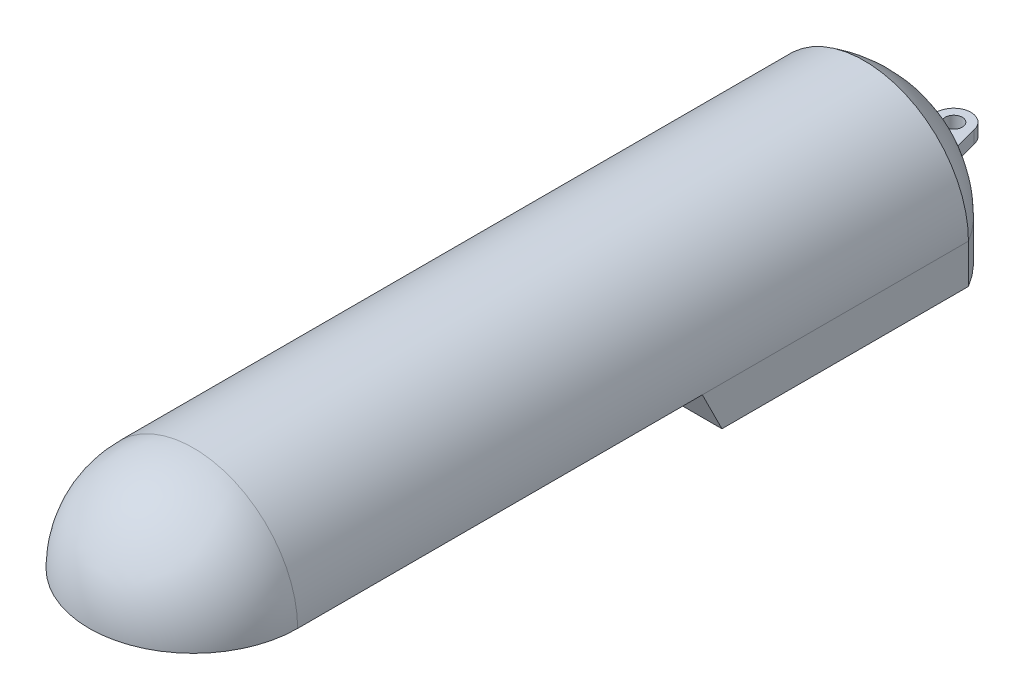
ISO-10303-21;
HEADER;
FILE_DESCRIPTION(('STEP AP214'),'2;1');
FILE_NAME('part.step','',(''),(''),'','','');
FILE_SCHEMA(('AUTOMOTIVE_DESIGN { 1 0 10303 214 1 1 1 1 }'));
ENDSEC;
DATA;
#1=APPLICATION_CONTEXT('core data for automotive mechanical design processes');
#2=APPLICATION_PROTOCOL_DEFINITION('international standard','automotive_design',2000,#1);
#3=PRODUCT_CONTEXT('',#1,'mechanical');
#4=PRODUCT('Part','Part','',(#3));
#5=PRODUCT_RELATED_PRODUCT_CATEGORY('part','',(#4));
#6=PRODUCT_DEFINITION_FORMATION('','',#4);
#7=PRODUCT_DEFINITION_CONTEXT('part definition',#1,'design');
#8=PRODUCT_DEFINITION('design','',#6,#7);
#9=PRODUCT_DEFINITION_SHAPE('','',#8);
#10=(LENGTH_UNIT() NAMED_UNIT(*) SI_UNIT(.MILLI.,.METRE.));
#11=(NAMED_UNIT(*) PLANE_ANGLE_UNIT() SI_UNIT($,.RADIAN.));
#12=(NAMED_UNIT(*) SI_UNIT($,.STERADIAN.) SOLID_ANGLE_UNIT());
#13=UNCERTAINTY_MEASURE_WITH_UNIT(LENGTH_MEASURE(1.E-05),#10,'distance_accuracy_value','');
#14=(GEOMETRIC_REPRESENTATION_CONTEXT(3) GLOBAL_UNCERTAINTY_ASSIGNED_CONTEXT((#13)) GLOBAL_UNIT_ASSIGNED_CONTEXT((#10,
#11,#12)) REPRESENTATION_CONTEXT('',''));
#15=CARTESIAN_POINT('',(0.,0.,0.));
#16=DIRECTION('',(0.,0.,1.));
#17=DIRECTION('',(1.,0.,0.));
#18=AXIS2_PLACEMENT_3D('',#15,#16,#17);
#19=CARTESIAN_POINT('',(0.,-2.49999999999999,-82.8697916666667));
#20=DIRECTION('',(0.,1.,0.));
#21=DIRECTION('',(-1.,0.,0.));
#22=AXIS2_PLACEMENT_3D('',#19,#20,#21);
#23=PLANE('',#22);
#24=CARTESIAN_POINT('',(0.,-2.49999999999999,-145.));
#25=DIRECTION('',(0.,1.,0.));
#26=DIRECTION('',(-1.,0.,0.));
#27=AXIS2_PLACEMENT_3D('',#24,#25,#26);
#28=CIRCLE('',#27,3.49999999999999);
#29=CARTESIAN_POINT('',(-3.49999999999999,-2.49999999999999,-145.));
#30=VERTEX_POINT('',#29);
#31=EDGE_CURVE('E350',#30,#30,#28,.T.);
#32=ORIENTED_EDGE('',*,*,#31,.T.);
#33=EDGE_LOOP('',(#32));
#34=FACE_BOUND('',#33,.T.);
#35=CARTESIAN_POINT('',(0.,-2.49999999999999,-82.8697916666667));
#36=DIRECTION('',(0.,-1.,0.));
#37=DIRECTION('',(-1.,0.,0.));
#38=AXIS2_PLACEMENT_3D('',#35,#36,#37);
#39=CIRCLE('',#38,49.6302083333333);
#40=CARTESIAN_POINT('',(-10.9239933505044,-2.49999999999999,-131.282847224937));
#41=VERTEX_POINT('',#40);
#42=CARTESIAN_POINT('',(10.9239933505044,-2.49999999999998,-131.282847224937));
#43=VERTEX_POINT('',#42);
#44=EDGE_CURVE('E12',#41,#43,#39,.T.);
#45=ORIENTED_EDGE('',*,*,#44,.F.);
#46=DIRECTION('',(0.259513331356115,0.,-0.965739525363051));
#47=VECTOR('',#46,1.);
#48=CARTESIAN_POINT('',(-6.8477866983021,-2.49999999999999,-146.451832405809));
#49=LINE('',#48,#47);
#50=CARTESIAN_POINT('',(-6.8477866983021,-2.49999999999999,-146.451832405809));
#51=VERTEX_POINT('',#50);
#52=EDGE_CURVE('E326',#41,#51,#49,.T.);
#53=ORIENTED_EDGE('',*,*,#52,.T.);
#54=CARTESIAN_POINT('',(0.,-2.49999999999999,-145.));
#55=DIRECTION('',(0.,-1.,0.));
#56=DIRECTION('',(-1.,0.,0.));
#57=AXIS2_PLACEMENT_3D('',#54,#55,#56);
#58=CIRCLE('',#57,7.00000000000002);
#59=CARTESIAN_POINT('',(6.84778669830212,-2.49999999999998,-146.451832405809));
#60=VERTEX_POINT('',#59);
#61=EDGE_CURVE('E329',#51,#60,#58,.T.);
#62=ORIENTED_EDGE('',*,*,#61,.T.);
#63=DIRECTION('',(0.259513331356117,0.,0.965739525363051));
#64=VECTOR('',#63,1.);
#65=CARTESIAN_POINT('',(10.9239933505044,-2.49999999999998,-131.282847224937));
#66=LINE('',#65,#64);
#67=EDGE_CURVE('E324',#60,#43,#66,.T.);
#68=ORIENTED_EDGE('',*,*,#67,.T.);
#69=EDGE_LOOP('',(#45,#53,#62,#68));
#70=FACE_BOUND('',#69,.T.);
#71=ADVANCED_FACE('F52',(#34,#70),#23,.F.);
#72=CARTESIAN_POINT('',(13.25,0.,37.5));
#73=DIRECTION('',(0.,-1.,0.));
#74=DIRECTION('',(0.,0.,-1.));
#75=AXIS2_PLACEMENT_3D('',#72,#73,#74);
#76=PLANE('',#75);
#77=DIRECTION('',(0.,0.,-1.));
#78=VECTOR('',#77,1.);
#79=CARTESIAN_POINT('',(-40.5,0.,165.));
#80=LINE('',#79,#78);
#81=CARTESIAN_POINT('',(-40.5,0.,165.));
#82=VERTEX_POINT('',#81);
#83=CARTESIAN_POINT('',(-40.5,0.,0.));
#84=VERTEX_POINT('',#83);
#85=EDGE_CURVE('E341',#82,#84,#80,.T.);
#86=ORIENTED_EDGE('',*,*,#85,.F.);
#87=CARTESIAN_POINT('',(0.,0.,165.));
#88=DIRECTION('',(0.,-1.,0.));
#89=DIRECTION('',(-1.,0.,0.));
#90=AXIS2_PLACEMENT_3D('',#87,#88,#89);
#91=CIRCLE('',#90,40.5);
#92=CARTESIAN_POINT('',(40.5,0.,165.));
#93=VERTEX_POINT('',#92);
#94=EDGE_CURVE('E159',#93,#82,#91,.T.);
#95=ORIENTED_EDGE('',*,*,#94,.F.);
#96=DIRECTION('',(0.,0.,-1.));
#97=VECTOR('',#96,1.);
#98=CARTESIAN_POINT('',(40.5,0.,165.));
#99=LINE('',#98,#97);
#100=CARTESIAN_POINT('',(40.5,0.,0.));
#101=VERTEX_POINT('',#100);
#102=EDGE_CURVE('E343',#101,#93,#99,.F.);
#103=ORIENTED_EDGE('',*,*,#102,.F.);
#104=DIRECTION('',(-1.,0.,0.));
#105=VECTOR('',#104,1.);
#106=CARTESIAN_POINT('',(-42.5,0.,0.));
#107=LINE('',#106,#105);
#108=CARTESIAN_POINT('',(42.5,0.,0.));
#109=VERTEX_POINT('',#108);
#110=EDGE_CURVE('E154',#109,#101,#107,.T.);
#111=ORIENTED_EDGE('',*,*,#110,.F.);
#112=DIRECTION('',(0.,0.,1.));
#113=VECTOR('',#112,1.);
#114=CARTESIAN_POINT('',(42.5,0.,82.5));
#115=LINE('',#114,#113);
#116=CARTESIAN_POINT('',(42.5,0.,165.));
#117=VERTEX_POINT('',#116);
#118=EDGE_CURVE('E145',#109,#117,#115,.T.);
#119=ORIENTED_EDGE('',*,*,#118,.T.);
#120=CARTESIAN_POINT('',(0.,0.,165.));
#121=DIRECTION('',(0.,-1.,0.));
#122=DIRECTION('',(-1.,0.,0.));
#123=AXIS2_PLACEMENT_3D('',#120,#121,#122);
#124=CIRCLE('',#123,42.5);
#125=CARTESIAN_POINT('',(-42.5,0.,165.));
#126=VERTEX_POINT('',#125);
#127=EDGE_CURVE('E150',#117,#126,#124,.T.);
#128=ORIENTED_EDGE('',*,*,#127,.T.);
#129=DIRECTION('',(0.,0.,1.));
#130=VECTOR('',#129,1.);
#131=CARTESIAN_POINT('',(-42.5,0.,82.5));
#132=LINE('',#131,#130);
#133=CARTESIAN_POINT('',(-42.5,0.,0.));
#134=VERTEX_POINT('',#133);
#135=EDGE_CURVE('E164',#134,#126,#132,.T.);
#136=ORIENTED_EDGE('',*,*,#135,.F.);
#137=EDGE_CURVE('E77',#84,#134,#107,.T.);
#138=ORIENTED_EDGE('',*,*,#137,.F.);
#139=EDGE_LOOP('',(#86,#95,#103,#111,#119,#128,#136,#138));
#140=FACE_BOUND('',#139,.T.);
#141=ADVANCED_FACE('F148',(#140),#76,.T.);
#142=CARTESIAN_POINT('',(0.,0.,103.75));
#143=DIRECTION('',(0.,0.,1.));
#144=DIRECTION('',(0.,-1.,0.));
#145=AXIS2_PLACEMENT_3D('',#142,#143,#144);
#146=CYLINDRICAL_SURFACE('',#145,42.5);
#147=CARTESIAN_POINT('',(0.,0.,165.));
#148=DIRECTION('',(0.,0.,1.));
#149=DIRECTION('',(0.,-1.,0.));
#150=AXIS2_PLACEMENT_3D('',#147,#148,#149);
#151=CIRCLE('',#150,42.5);
#152=EDGE_CURVE('E161',#117,#126,#151,.T.);
#153=ORIENTED_EDGE('',*,*,#152,.F.);
#154=ORIENTED_EDGE('',*,*,#118,.F.);
#155=CARTESIAN_POINT('',(42.5,0.,-108.5));
#156=VERTEX_POINT('',#155);
#157=EDGE_CURVE('E158',#156,#109,#115,.T.);
#158=ORIENTED_EDGE('',*,*,#157,.F.);
#159=CARTESIAN_POINT('',(0.,0.,-108.5));
#160=DIRECTION('',(0.,0.,1.));
#161=DIRECTION('',(0.,-1.,0.));
#162=AXIS2_PLACEMENT_3D('',#159,#160,#161);
#163=CIRCLE('',#162,42.5);
#164=CARTESIAN_POINT('',(-42.5,0.,-108.5));
#165=VERTEX_POINT('',#164);
#166=EDGE_CURVE('E167',#156,#165,#163,.T.);
#167=ORIENTED_EDGE('',*,*,#166,.T.);
#168=EDGE_CURVE('E61',#165,#134,#132,.T.);
#169=ORIENTED_EDGE('',*,*,#168,.T.);
#170=ORIENTED_EDGE('',*,*,#135,.T.);
#171=EDGE_LOOP('',(#153,#154,#158,#167,#169,#170));
#172=FACE_BOUND('',#171,.T.);
#173=ADVANCED_FACE('F162',(#172),#146,.T.);
#174=CARTESIAN_POINT('',(0.,0.,165.));
#175=DIRECTION('',(0.,0.,1.));
#176=DIRECTION('',(1.,0.,0.));
#177=AXIS2_PLACEMENT_3D('',#174,#175,#176);
#178=SPHERICAL_SURFACE('',#177,42.5);
#179=ORIENTED_EDGE('',*,*,#152,.T.);
#180=ORIENTED_EDGE('',*,*,#127,.F.);
#181=EDGE_LOOP('',(#179,#180));
#182=FACE_BOUND('',#181,.T.);
#183=ADVANCED_FACE('F169',(#182),#178,.T.);
#184=CARTESIAN_POINT('',(0.,0.,165.));
#185=DIRECTION('',(0.,0.,1.));
#186=DIRECTION('',(1.,0.,0.));
#187=AXIS2_PLACEMENT_3D('',#184,#185,#186);
#188=SPHERICAL_SURFACE('',#187,40.5);
#189=CARTESIAN_POINT('',(0.,0.,165.));
#190=DIRECTION('',(0.,0.,-1.));
#191=DIRECTION('',(0.,1.,0.));
#192=AXIS2_PLACEMENT_3D('',#189,#190,#191);
#193=CIRCLE('',#192,40.5);
#194=EDGE_CURVE('E346',#82,#93,#193,.T.);
#195=ORIENTED_EDGE('',*,*,#194,.T.);
#196=ORIENTED_EDGE('',*,*,#94,.T.);
#197=EDGE_LOOP('',(#195,#196));
#198=FACE_BOUND('',#197,.T.);
#199=ADVANCED_FACE('F436',(#198),#188,.F.);
#200=CARTESIAN_POINT('',(0.,0.,-82.8697916666667));
#201=DIRECTION('',(0.,0.,1.));
#202=DIRECTION('',(-1.,0.,0.));
#203=AXIS2_PLACEMENT_3D('',#200,#201,#202);
#204=SPHERICAL_SURFACE('',#203,49.6302083333333);
#205=CARTESIAN_POINT('',(0.,0.,-82.8697916666667));
#206=DIRECTION('',(0.,-1.,0.));
#207=DIRECTION('',(-1.,0.,0.));
#208=AXIS2_PLACEMENT_3D('',#205,#206,#207);
#209=CIRCLE('',#208,49.6302083333333);
#210=CARTESIAN_POINT('',(10.9239933505044,0.,-131.282847224937));
#211=VERTEX_POINT('',#210);
#212=EDGE_CURVE('E240',#211,#156,#209,.T.);
#213=ORIENTED_EDGE('',*,*,#212,.F.);
#214=CARTESIAN_POINT('',(22.3216837584603,0.,-88.8680700445327));
#215=DIRECTION('',(0.965739525363051,0.,-0.259513331356117));
#216=DIRECTION('',(-0.259513331356117,0.,-0.965739525363051));
#217=AXIS2_PLACEMENT_3D('',#214,#215,#216);
#218=CIRCLE('',#217,43.9194793901179);
#219=CARTESIAN_POINT('',(10.9424734682682,2.5,-131.214076267913));
#220=VERTEX_POINT('',#219);
#221=EDGE_CURVE('E241',#211,#220,#218,.T.);
#222=ORIENTED_EDGE('',*,*,#221,.T.);
#223=CARTESIAN_POINT('',(0.,2.5,-82.8697916666667));
#224=DIRECTION('',(0.,1.,0.));
#225=DIRECTION('',(1.,0.,0.));
#226=AXIS2_PLACEMENT_3D('',#223,#224,#225);
#227=CIRCLE('',#226,49.567202656697);
#228=CARTESIAN_POINT('',(-10.9424734682683,2.5,-131.214076267913));
#229=VERTEX_POINT('',#228);
#230=EDGE_CURVE('E287',#220,#229,#227,.T.);
#231=ORIENTED_EDGE('',*,*,#230,.T.);
#232=CARTESIAN_POINT('',(-22.3216837584603,0.,-88.8680700445327));
#233=DIRECTION('',(0.965739525363051,0.,0.259513331356117));
#234=DIRECTION('',(0.259513331356117,0.,-0.965739525363051));
#235=AXIS2_PLACEMENT_3D('',#232,#233,#234);
#236=CIRCLE('',#235,43.9194793901178);
#237=CARTESIAN_POINT('',(-10.9239933505044,0.,-131.282847224937));
#238=VERTEX_POINT('',#237);
#239=EDGE_CURVE('E238',#238,#229,#236,.T.);
#240=ORIENTED_EDGE('',*,*,#239,.F.);
#241=EDGE_CURVE('E234',#165,#238,#209,.T.);
#242=ORIENTED_EDGE('',*,*,#241,.F.);
#243=ORIENTED_EDGE('',*,*,#166,.F.);
#244=EDGE_LOOP('',(#213,#222,#231,#240,#242,#243));
#245=FACE_BOUND('',#244,.T.);
#246=ADVANCED_FACE('F311',(#245),#204,.T.);
#247=CARTESIAN_POINT('',(8.92389334915106,-2.5,-138.725916202904));
#248=DIRECTION('',(0.965739525363051,0.,-0.259513331356117));
#249=DIRECTION('',(-0.259513331356117,0.,-0.965739525363051));
#250=AXIS2_PLACEMENT_3D('',#247,#248,#249);
#251=PLANE('',#250);
#252=ORIENTED_EDGE('',*,*,#221,.F.);
#253=DIRECTION('',(0.,1.,0.));
#254=VECTOR('',#253,1.);
#255=CARTESIAN_POINT('',(10.9239933505044,-2.49999999999998,-131.282847224937));
#256=LINE('',#255,#254);
#257=EDGE_CURVE('E320',#43,#211,#256,.T.);
#258=ORIENTED_EDGE('',*,*,#257,.F.);
#259=ORIENTED_EDGE('',*,*,#67,.F.);
#260=DIRECTION('',(0.,1.,0.));
#261=VECTOR('',#260,1.);
#262=CARTESIAN_POINT('',(6.84778669830212,-2.5,-146.451832405809));
#263=LINE('',#262,#261);
#264=CARTESIAN_POINT('',(6.84778669830212,2.5,-146.451832405809));
#265=VERTEX_POINT('',#264);
#266=EDGE_CURVE('E239',#60,#265,#263,.T.);
#267=ORIENTED_EDGE('',*,*,#266,.T.);
#268=DIRECTION('',(-0.259513331356117,0.,-0.965739525363051));
#269=VECTOR('',#268,1.);
#270=CARTESIAN_POINT('',(8.92389334915106,2.5,-138.725916202904));
#271=LINE('',#270,#269);
#272=EDGE_CURVE('E279',#220,#265,#271,.T.);
#273=ORIENTED_EDGE('',*,*,#272,.F.);
#274=EDGE_LOOP('',(#252,#258,#259,#267,#273));
#275=FACE_BOUND('',#274,.T.);
#276=ADVANCED_FACE('F375',(#275),#251,.T.);
#277=CARTESIAN_POINT('',(-8.92389334915104,-2.5,-138.725916202904));
#278=DIRECTION('',(0.965739525363051,0.,0.259513331356117));
#279=DIRECTION('',(0.259513331356117,0.,-0.965739525363051));
#280=AXIS2_PLACEMENT_3D('',#277,#278,#279);
#281=PLANE('',#280);
#282=DIRECTION('',(0.,1.,0.));
#283=VECTOR('',#282,1.);
#284=CARTESIAN_POINT('',(-6.8477866983021,-2.5,-146.451832405809));
#285=LINE('',#284,#283);
#286=CARTESIAN_POINT('',(-6.8477866983021,2.5,-146.451832405809));
#287=VERTEX_POINT('',#286);
#288=EDGE_CURVE('E259',#51,#287,#285,.T.);
#289=ORIENTED_EDGE('',*,*,#288,.F.);
#290=ORIENTED_EDGE('',*,*,#52,.F.);
#291=DIRECTION('',(0.,1.,0.));
#292=VECTOR('',#291,1.);
#293=CARTESIAN_POINT('',(-10.9239933505044,-2.49999999999999,-131.282847224937));
#294=LINE('',#293,#292);
#295=EDGE_CURVE('E319',#41,#238,#294,.T.);
#296=ORIENTED_EDGE('',*,*,#295,.T.);
#297=ORIENTED_EDGE('',*,*,#239,.T.);
#298=DIRECTION('',(0.259513331356117,0.,-0.965739525363051));
#299=VECTOR('',#298,1.);
#300=CARTESIAN_POINT('',(-8.92389334915104,2.5,-138.725916202904));
#301=LINE('',#300,#299);
#302=EDGE_CURVE('E275',#229,#287,#301,.T.);
#303=ORIENTED_EDGE('',*,*,#302,.T.);
#304=EDGE_LOOP('',(#289,#290,#296,#297,#303));
#305=FACE_BOUND('',#304,.T.);
#306=ADVANCED_FACE('F368',(#305),#281,.F.);
#307=CARTESIAN_POINT('',(0.,-2.5,-145.));
#308=DIRECTION('',(0.,1.,0.));
#309=DIRECTION('',(1.,0.,0.));
#310=AXIS2_PLACEMENT_3D('',#307,#308,#309);
#311=CYLINDRICAL_SURFACE('',#310,7.);
#312=ORIENTED_EDGE('',*,*,#266,.F.);
#313=ORIENTED_EDGE('',*,*,#61,.F.);
#314=ORIENTED_EDGE('',*,*,#288,.T.);
#315=CARTESIAN_POINT('',(0.,2.5,-145.));
#316=DIRECTION('',(0.,-1.,0.));
#317=DIRECTION('',(1.,0.,0.));
#318=AXIS2_PLACEMENT_3D('',#315,#316,#317);
#319=CIRCLE('',#318,7.);
#320=EDGE_CURVE('E253',#287,#265,#319,.T.);
#321=ORIENTED_EDGE('',*,*,#320,.T.);
#322=EDGE_LOOP('',(#312,#313,#314,#321));
#323=FACE_BOUND('',#322,.T.);
#324=ADVANCED_FACE('F363',(#323),#311,.T.);
#325=CARTESIAN_POINT('',(0.,2.5,-76.));
#326=DIRECTION('',(0.,1.,0.));
#327=DIRECTION('',(1.,0.,0.));
#328=AXIS2_PLACEMENT_3D('',#325,#326,#327);
#329=PLANE('',#328);
#330=CARTESIAN_POINT('',(0.,2.5,-145.));
#331=DIRECTION('',(0.,1.,0.));
#332=DIRECTION('',(0.,0.,1.));
#333=AXIS2_PLACEMENT_3D('',#330,#331,#332);
#334=CIRCLE('',#333,3.49999999999999);
#335=CARTESIAN_POINT('',(0.,2.5,-141.5));
#336=VERTEX_POINT('',#335);
#337=EDGE_CURVE('E353',#336,#336,#334,.T.);
#338=ORIENTED_EDGE('',*,*,#337,.F.);
#339=EDGE_LOOP('',(#338));
#340=FACE_BOUND('',#339,.T.);
#341=ORIENTED_EDGE('',*,*,#230,.F.);
#342=ORIENTED_EDGE('',*,*,#272,.T.);
#343=ORIENTED_EDGE('',*,*,#320,.F.);
#344=ORIENTED_EDGE('',*,*,#302,.F.);
#345=EDGE_LOOP('',(#341,#342,#343,#344));
#346=FACE_BOUND('',#345,.T.);
#347=ADVANCED_FACE('F360',(#340,#346),#329,.T.);
#348=CARTESIAN_POINT('',(0.,-2.49999999999999,-82.8697916666667));
#349=DIRECTION('',(0.,1.,0.));
#350=DIRECTION('',(-1.,0.,0.));
#351=AXIS2_PLACEMENT_3D('',#348,#349,#350);
#352=CYLINDRICAL_SURFACE('',#351,49.6302083333333);
#353=ORIENTED_EDGE('',*,*,#212,.T.);
#354=DIRECTION('',(0.,1.,0.));
#355=VECTOR('',#354,1.);
#356=CARTESIAN_POINT('',(42.5,-2.49999999999998,-108.5));
#357=LINE('',#356,#355);
#358=CARTESIAN_POINT('',(42.5,-16.,-108.5));
#359=VERTEX_POINT('',#358);
#360=EDGE_CURVE('E260',#359,#156,#357,.T.);
#361=ORIENTED_EDGE('',*,*,#360,.F.);
#362=CARTESIAN_POINT('',(0.,-16.,-82.8697916666667));
#363=DIRECTION('',(0.,-1.,0.));
#364=DIRECTION('',(-1.,0.,0.));
#365=AXIS2_PLACEMENT_3D('',#362,#363,#364);
#366=CIRCLE('',#365,49.6302083333333);
#367=CARTESIAN_POINT('',(-42.5,-16.,-108.5));
#368=VERTEX_POINT('',#367);
#369=EDGE_CURVE('E318',#368,#359,#366,.T.);
#370=ORIENTED_EDGE('',*,*,#369,.F.);
#371=DIRECTION('',(0.,1.,0.));
#372=VECTOR('',#371,1.);
#373=CARTESIAN_POINT('',(-42.4999999999999,-2.5,-108.5));
#374=LINE('',#373,#372);
#375=EDGE_CURVE('E99',#368,#165,#374,.T.);
#376=ORIENTED_EDGE('',*,*,#375,.T.);
#377=ORIENTED_EDGE('',*,*,#241,.T.);
#378=ORIENTED_EDGE('',*,*,#295,.F.);
#379=ORIENTED_EDGE('',*,*,#44,.T.);
#380=ORIENTED_EDGE('',*,*,#257,.T.);
#381=EDGE_LOOP('',(#353,#361,#370,#376,#377,#378,#379,#380));
#382=FACE_BOUND('',#381,.T.);
#383=ADVANCED_FACE('F316',(#382),#352,.T.);
#384=CARTESIAN_POINT('',(42.5,-2.49999999999999,0.));
#385=DIRECTION('',(-1.,0.,0.));
#386=DIRECTION('',(0.,-1.,0.));
#387=AXIS2_PLACEMENT_3D('',#384,#385,#386);
#388=PLANE('',#387);
#389=ORIENTED_EDGE('',*,*,#157,.T.);
#390=DIRECTION('',(0.,-0.894427190999914,-0.447213595499961));
#391=VECTOR('',#390,1.);
#392=CARTESIAN_POINT('',(42.5,0.,0.));
#393=LINE('',#392,#391);
#394=CARTESIAN_POINT('',(42.5,-16.,-8.00000000000007));
#395=VERTEX_POINT('',#394);
#396=EDGE_CURVE('E185',#395,#109,#393,.F.);
#397=ORIENTED_EDGE('',*,*,#396,.F.);
#398=DIRECTION('',(0.,0.,1.));
#399=VECTOR('',#398,1.);
#400=CARTESIAN_POINT('',(42.5,-16.,0.));
#401=LINE('',#400,#399);
#402=EDGE_CURVE('E337',#359,#395,#401,.T.);
#403=ORIENTED_EDGE('',*,*,#402,.F.);
#404=ORIENTED_EDGE('',*,*,#360,.T.);
#405=EDGE_LOOP('',(#389,#397,#403,#404));
#406=FACE_BOUND('',#405,.T.);
#407=ADVANCED_FACE('F398',(#406),#388,.F.);
#408=CARTESIAN_POINT('',(-42.5,0.,0.));
#409=DIRECTION('',(0.,-0.447213595499961,0.894427190999914));
#410=DIRECTION('',(0.,-0.894427190999914,-0.447213595499961));
#411=AXIS2_PLACEMENT_3D('',#408,#409,#410);
#412=PLANE('',#411);
#413=ORIENTED_EDGE('',*,*,#110,.T.);
#414=EDGE_CURVE('E327',#101,#84,#107,.T.);
#415=ORIENTED_EDGE('',*,*,#414,.T.);
#416=ORIENTED_EDGE('',*,*,#137,.T.);
#417=DIRECTION('',(0.,-0.894427190999914,-0.447213595499961));
#418=VECTOR('',#417,1.);
#419=CARTESIAN_POINT('',(-42.5,-45.4000000000002,-22.7000000000003));
#420=LINE('',#419,#418);
#421=CARTESIAN_POINT('',(-42.5,-16.,-8.00000000000008));
#422=VERTEX_POINT('',#421);
#423=EDGE_CURVE('E56',#422,#134,#420,.F.);
#424=ORIENTED_EDGE('',*,*,#423,.F.);
#425=DIRECTION('',(1.,0.,0.));
#426=VECTOR('',#425,1.);
#427=CARTESIAN_POINT('',(0.,-16.,-8.00000000000006));
#428=LINE('',#427,#426);
#429=EDGE_CURVE('E336',#395,#422,#428,.F.);
#430=ORIENTED_EDGE('',*,*,#429,.F.);
#431=ORIENTED_EDGE('',*,*,#396,.T.);
#432=EDGE_LOOP('',(#413,#415,#416,#424,#430,#431));
#433=FACE_BOUND('',#432,.T.);
#434=ADVANCED_FACE('F54',(#433),#412,.T.);
#435=CARTESIAN_POINT('',(-42.5,-2.5,-108.5));
#436=DIRECTION('',(1.,0.,0.));
#437=DIRECTION('',(0.,1.,0.));
#438=AXIS2_PLACEMENT_3D('',#435,#436,#437);
#439=PLANE('',#438);
#440=ORIENTED_EDGE('',*,*,#168,.F.);
#441=ORIENTED_EDGE('',*,*,#375,.F.);
#442=DIRECTION('',(0.,0.,-1.));
#443=VECTOR('',#442,1.);
#444=CARTESIAN_POINT('',(-42.5,-16.,-108.5));
#445=LINE('',#444,#443);
#446=EDGE_CURVE('E334',#422,#368,#445,.T.);
#447=ORIENTED_EDGE('',*,*,#446,.F.);
#448=ORIENTED_EDGE('',*,*,#423,.T.);
#449=EDGE_LOOP('',(#440,#441,#447,#448));
#450=FACE_BOUND('',#449,.T.);
#451=ADVANCED_FACE('F314',(#450),#439,.F.);
#452=CARTESIAN_POINT('',(0.,-16.,-82.8697916666667));
#453=DIRECTION('',(0.,1.,0.));
#454=DIRECTION('',(-1.,0.,0.));
#455=AXIS2_PLACEMENT_3D('',#452,#453,#454);
#456=PLANE('',#455);
#457=ORIENTED_EDGE('',*,*,#369,.T.);
#458=ORIENTED_EDGE('',*,*,#402,.T.);
#459=ORIENTED_EDGE('',*,*,#429,.T.);
#460=ORIENTED_EDGE('',*,*,#446,.T.);
#461=EDGE_LOOP('',(#457,#458,#459,#460));
#462=FACE_BOUND('',#461,.T.);
#463=ADVANCED_FACE('F394',(#462),#456,.F.);
#464=CARTESIAN_POINT('',(0.,0.,0.));
#465=DIRECTION('',(0.,0.,-1.));
#466=DIRECTION('',(0.,1.,0.));
#467=AXIS2_PLACEMENT_3D('',#464,#465,#466);
#468=PLANE('',#467);
#469=CARTESIAN_POINT('',(0.,0.,0.));
#470=DIRECTION('',(0.,0.,-1.));
#471=DIRECTION('',(0.,1.,0.));
#472=AXIS2_PLACEMENT_3D('',#469,#470,#471);
#473=CIRCLE('',#472,40.5);
#474=EDGE_CURVE('E68',#84,#101,#473,.T.);
#475=ORIENTED_EDGE('',*,*,#474,.F.);
#476=ORIENTED_EDGE('',*,*,#414,.F.);
#477=EDGE_LOOP('',(#475,#476));
#478=FACE_BOUND('',#477,.T.);
#479=ADVANCED_FACE('F424',(#478),#468,.F.);
#480=CARTESIAN_POINT('',(0.,0.,165.));
#481=DIRECTION('',(0.,0.,-1.));
#482=DIRECTION('',(0.,1.,0.));
#483=AXIS2_PLACEMENT_3D('',#480,#481,#482);
#484=CYLINDRICAL_SURFACE('',#483,40.5);
#485=ORIENTED_EDGE('',*,*,#85,.T.);
#486=ORIENTED_EDGE('',*,*,#474,.T.);
#487=ORIENTED_EDGE('',*,*,#102,.T.);
#488=ORIENTED_EDGE('',*,*,#194,.F.);
#489=EDGE_LOOP('',(#485,#486,#487,#488));
#490=FACE_BOUND('',#489,.T.);
#491=ADVANCED_FACE('F452',(#490),#484,.F.);
#492=CARTESIAN_POINT('',(0.,2.5,-145.));
#493=DIRECTION('',(0.,1.,0.));
#494=DIRECTION('',(0.,0.,1.));
#495=AXIS2_PLACEMENT_3D('',#492,#493,#494);
#496=CYLINDRICAL_SURFACE('',#495,3.49999999999999);
#497=ORIENTED_EDGE('',*,*,#337,.T.);
#498=EDGE_LOOP('',(#497));
#499=FACE_BOUND('',#498,.T.);
#500=ORIENTED_EDGE('',*,*,#31,.F.);
#501=EDGE_LOOP('',(#500));
#502=FACE_BOUND('',#501,.T.);
#503=ADVANCED_FACE('F357',(#499,#502),#496,.F.);
#504=CLOSED_SHELL('',(#71,#141,#173,#183,#199,#246,#276,#306,#324,#347,#383,#407,#434,#451,#463,
#479,#491,#503));
#505=MANIFOLD_SOLID_BREP('B2',#504);
#506=ADVANCED_BREP_SHAPE_REPRESENTATION('',(#18,#505),#14);
#507=SHAPE_DEFINITION_REPRESENTATION(#9,#506);
ENDSEC;
END-ISO-10303-21;
